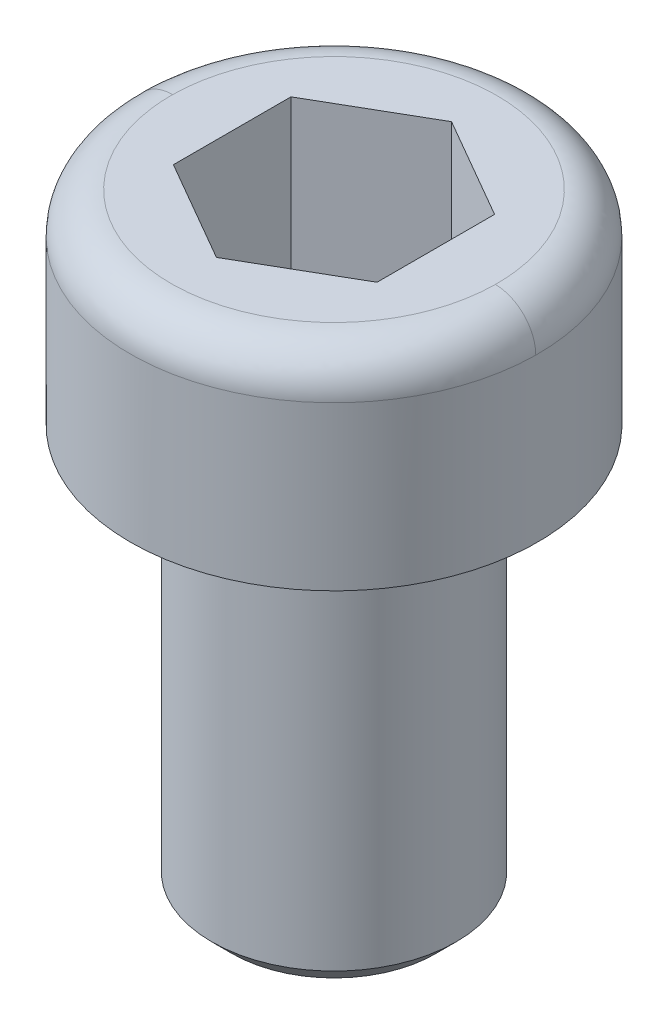
ISO-10303-21;
HEADER;
FILE_DESCRIPTION(('STEP AP214'),'2;1');
FILE_NAME('part.step','',(''),(''),'','','');
FILE_SCHEMA(('AUTOMOTIVE_DESIGN { 1 0 10303 214 1 1 1 1 }'));
ENDSEC;
DATA;
#1=APPLICATION_CONTEXT('core data for automotive mechanical design processes');
#2=APPLICATION_PROTOCOL_DEFINITION('international standard','automotive_design',2000,#1);
#3=PRODUCT_CONTEXT('',#1,'mechanical');
#4=PRODUCT('Part','Part','',(#3));
#5=PRODUCT_RELATED_PRODUCT_CATEGORY('part','',(#4));
#6=PRODUCT_DEFINITION_FORMATION('','',#4);
#7=PRODUCT_DEFINITION_CONTEXT('part definition',#1,'design');
#8=PRODUCT_DEFINITION('design','',#6,#7);
#9=PRODUCT_DEFINITION_SHAPE('','',#8);
#10=(LENGTH_UNIT() NAMED_UNIT(*) SI_UNIT(.MILLI.,.METRE.));
#11=(NAMED_UNIT(*) PLANE_ANGLE_UNIT() SI_UNIT($,.RADIAN.));
#12=(NAMED_UNIT(*) SI_UNIT($,.STERADIAN.) SOLID_ANGLE_UNIT());
#13=UNCERTAINTY_MEASURE_WITH_UNIT(LENGTH_MEASURE(1.E-05),#10,'distance_accuracy_value','');
#14=(GEOMETRIC_REPRESENTATION_CONTEXT(3) GLOBAL_UNCERTAINTY_ASSIGNED_CONTEXT((#13)) GLOBAL_UNIT_ASSIGNED_CONTEXT((#10,
#11,#12)) REPRESENTATION_CONTEXT('',''));
#15=CARTESIAN_POINT('',(0.,0.,0.));
#16=DIRECTION('',(0.,0.,1.));
#17=DIRECTION('',(1.,0.,0.));
#18=AXIS2_PLACEMENT_3D('',#15,#16,#17);
#19=CARTESIAN_POINT('',(-32.9999999892,15.499999988,88.9433756816));
#20=DIRECTION('',(0.500000003922235,0.,0.866025401519935));
#21=DIRECTION('',(0.866025401519935,0.,-0.500000003922235));
#22=AXIS2_PLACEMENT_3D('',#19,#20,#21);
#23=PLANE('',#22);
#24=DIRECTION('',(0.,1.,0.));
#25=VECTOR('',#24,1.);
#26=CARTESIAN_POINT('',(-32.9999999892,16.4999999946,88.9433756816));
#27=LINE('',#26,#25);
#28=CARTESIAN_POINT('',(-32.9999999927244,15.499999988,88.9433756813983));
#29=VERTEX_POINT('',#28);
#30=CARTESIAN_POINT('',(-32.999999989706,17.5000000012,88.9433756816256));
#31=VERTEX_POINT('',#30);
#32=EDGE_CURVE('E174',#29,#31,#27,.T.);
#33=ORIENTED_EDGE('',*,*,#32,.T.);
#34=DIRECTION('',(-0.866025401519935,0.,0.500000003922235));
#35=VECTOR('',#34,1.);
#36=CARTESIAN_POINT('',(-32.3749999946,17.5000000012,88.5825317627));
#37=LINE('',#36,#35);
#38=CARTESIAN_POINT('',(-31.7499999942707,17.5000000012,88.2216878441177));
#39=VERTEX_POINT('',#38);
#40=EDGE_CURVE('E171',#39,#31,#37,.T.);
#41=ORIENTED_EDGE('',*,*,#40,.F.);
#42=DIRECTION('',(0.,-1.,0.));
#43=VECTOR('',#42,1.);
#44=CARTESIAN_POINT('',(-31.75,16.4999999946,88.2216878438));
#45=LINE('',#44,#43);
#46=CARTESIAN_POINT('',(-31.75,15.499999988,88.2216878438));
#47=VERTEX_POINT('',#46);
#48=EDGE_CURVE('E91',#39,#47,#45,.T.);
#49=ORIENTED_EDGE('',*,*,#48,.T.);
#50=DIRECTION('',(0.866025401519935,0.,-0.500000003922235));
#51=VECTOR('',#50,1.);
#52=CARTESIAN_POINT('',(-32.3749999946,15.499999988,88.5825317627));
#53=LINE('',#52,#51);
#54=EDGE_CURVE('E87',#29,#47,#53,.T.);
#55=ORIENTED_EDGE('',*,*,#54,.F.);
#56=EDGE_LOOP('',(#33,#41,#49,#55));
#57=FACE_BOUND('',#56,.T.);
#58=ADVANCED_FACE('F16',(#57),#23,.F.);
#59=CARTESIAN_POINT('',(-31.7350004872,9.9999999898,88.7649995334));
#60=DIRECTION('',(0.,-1.,0.));
#61=DIRECTION('',(-1.,0.,0.));
#62=AXIS2_PLACEMENT_3D('',#59,#60,#61);
#63=PLANE('',#62);
#64=CARTESIAN_POINT('',(-32.9999999892,10.000000193,87.500000006));
#65=DIRECTION('',(0.,1.,0.));
#66=DIRECTION('',(0.,0.,1.));
#67=AXIS2_PLACEMENT_3D('',#64,#65,#66);
#68=CIRCLE('',#67,1.24999953199996);
#69=CARTESIAN_POINT('',(-32.9999999892,10.000000193,88.749999538));
#70=VERTEX_POINT('',#69);
#71=EDGE_CURVE('E21',#70,#70,#68,.F.);
#72=ORIENTED_EDGE('',*,*,#71,.T.);
#73=EDGE_LOOP('',(#72));
#74=FACE_BOUND('',#73,.T.);
#75=ADVANCED_FACE('F302',(#74),#63,.T.);
#76=CARTESIAN_POINT('',(-34.2500000038,15.499999988,88.2216878438));
#77=DIRECTION('',(-0.499999996302237,0.,0.866025405919343));
#78=DIRECTION('',(0.866025405919343,0.,0.499999996302237));
#79=AXIS2_PLACEMENT_3D('',#76,#77,#78);
#80=PLANE('',#79);
#81=DIRECTION('',(0.,1.,0.));
#82=VECTOR('',#81,1.);
#83=CARTESIAN_POINT('',(-34.2500000038,16.4999999946,88.2216878438));
#84=LINE('',#83,#82);
#85=CARTESIAN_POINT('',(-34.2500000038,15.499999988,88.2216878438));
#86=VERTEX_POINT('',#85);
#87=CARTESIAN_POINT('',(-34.2500000003147,17.5000000012,88.2216878439589));
#88=VERTEX_POINT('',#87);
#89=EDGE_CURVE('E142',#86,#88,#84,.T.);
#90=ORIENTED_EDGE('',*,*,#89,.T.);
#91=DIRECTION('',(-0.866025405919343,0.,-0.499999996302237));
#92=VECTOR('',#91,1.);
#93=CARTESIAN_POINT('',(-33.6249999965,17.5000000012,88.5825317627));
#94=LINE('',#93,#92);
#95=EDGE_CURVE('E177',#31,#88,#94,.T.);
#96=ORIENTED_EDGE('',*,*,#95,.F.);
#97=ORIENTED_EDGE('',*,*,#32,.F.);
#98=DIRECTION('',(0.866025405919343,0.,0.499999996302237));
#99=VECTOR('',#98,1.);
#100=CARTESIAN_POINT('',(-33.6249999965,15.499999988,88.5825317627));
#101=LINE('',#100,#99);
#102=EDGE_CURVE('E179',#86,#29,#101,.T.);
#103=ORIENTED_EDGE('',*,*,#102,.F.);
#104=EDGE_LOOP('',(#90,#96,#97,#103));
#105=FACE_BOUND('',#104,.T.);
#106=ADVANCED_FACE('F298',(#105),#80,.F.);
#107=CARTESIAN_POINT('',(-31.75,15.499999988,88.2216878438));
#108=DIRECTION('',(1.,0.,0.));
#109=DIRECTION('',(0.,0.,-1.));
#110=AXIS2_PLACEMENT_3D('',#107,#108,#109);
#111=PLANE('',#110);
#112=ORIENTED_EDGE('',*,*,#48,.F.);
#113=DIRECTION('',(0.,0.,1.));
#114=VECTOR('',#113,1.);
#115=CARTESIAN_POINT('',(-31.75,17.5000000012,87.500000006));
#116=LINE('',#115,#114);
#117=CARTESIAN_POINT('',(-31.7499999942707,17.5000000012,86.7783121678823));
#118=VERTEX_POINT('',#117);
#119=EDGE_CURVE('E97',#118,#39,#116,.T.);
#120=ORIENTED_EDGE('',*,*,#119,.F.);
#121=DIRECTION('',(0.,-1.,0.));
#122=VECTOR('',#121,1.);
#123=CARTESIAN_POINT('',(-31.75,16.4999999946,86.7783121682));
#124=LINE('',#123,#122);
#125=CARTESIAN_POINT('',(-31.75,15.499999988,86.7783121682));
#126=VERTEX_POINT('',#125);
#127=EDGE_CURVE('E94',#118,#126,#124,.T.);
#128=ORIENTED_EDGE('',*,*,#127,.T.);
#129=DIRECTION('',(0.,0.,-1.));
#130=VECTOR('',#129,1.);
#131=CARTESIAN_POINT('',(-31.75,15.499999988,87.500000006));
#132=LINE('',#131,#130);
#133=EDGE_CURVE('E79',#47,#126,#132,.T.);
#134=ORIENTED_EDGE('',*,*,#133,.F.);
#135=EDGE_LOOP('',(#112,#120,#128,#134));
#136=FACE_BOUND('',#135,.T.);
#137=ADVANCED_FACE('F95',(#136),#111,.F.);
#138=CARTESIAN_POINT('',(-32.9999999892,10.000000193,87.500000006));
#139=DIRECTION('',(0.,1.,0.));
#140=DIRECTION('',(0.,0.,1.));
#141=AXIS2_PLACEMENT_3D('',#138,#139,#140);
#142=CONICAL_SURFACE('',#141,1.249999532,0.785397960197718);
#143=CARTESIAN_POINT('',(-32.9999999892,10.2500005566,87.500000006));
#144=DIRECTION('',(0.,-1.,0.));
#145=DIRECTION('',(0.,0.,-1.));
#146=AXIS2_PLACEMENT_3D('',#143,#144,#145);
#147=CIRCLE('',#146,1.49999999720001);
#148=CARTESIAN_POINT('',(-32.9999999892,10.2500005566,86.0000000088));
#149=VERTEX_POINT('',#148);
#150=EDGE_CURVE('E108',#149,#149,#147,.T.);
#151=ORIENTED_EDGE('',*,*,#150,.T.);
#152=EDGE_LOOP('',(#151));
#153=FACE_BOUND('',#152,.T.);
#154=ORIENTED_EDGE('',*,*,#71,.F.);
#155=EDGE_LOOP('',(#154));
#156=FACE_BOUND('',#155,.T.);
#157=ADVANCED_FACE('F309',(#153,#156),#142,.T.);
#158=CARTESIAN_POINT('',(-34.2500000038,15.499999988,86.7783121682));
#159=DIRECTION('',(-1.,0.,0.));
#160=DIRECTION('',(0.,0.,1.));
#161=AXIS2_PLACEMENT_3D('',#158,#159,#160);
#162=PLANE('',#161);
#163=DIRECTION('',(0.,1.,0.));
#164=VECTOR('',#163,1.);
#165=CARTESIAN_POINT('',(-34.2500000038,16.4999999946,86.7783121682));
#166=LINE('',#165,#164);
#167=CARTESIAN_POINT('',(-34.2500000038,15.499999988,86.7783121682));
#168=VERTEX_POINT('',#167);
#169=CARTESIAN_POINT('',(-34.2500000038,17.5000000012,86.7783121682));
#170=VERTEX_POINT('',#169);
#171=EDGE_CURVE('E137',#168,#170,#166,.T.);
#172=ORIENTED_EDGE('',*,*,#171,.T.);
#173=DIRECTION('',(0.,0.,-1.));
#174=VECTOR('',#173,1.);
#175=CARTESIAN_POINT('',(-34.2500000038,17.5000000012,87.500000006));
#176=LINE('',#175,#174);
#177=EDGE_CURVE('E140',#88,#170,#176,.T.);
#178=ORIENTED_EDGE('',*,*,#177,.F.);
#179=ORIENTED_EDGE('',*,*,#89,.F.);
#180=DIRECTION('',(0.,0.,1.));
#181=VECTOR('',#180,1.);
#182=CARTESIAN_POINT('',(-34.2500000038,15.499999988,87.500000006));
#183=LINE('',#182,#181);
#184=EDGE_CURVE('E106',#168,#86,#183,.T.);
#185=ORIENTED_EDGE('',*,*,#184,.F.);
#186=EDGE_LOOP('',(#172,#178,#179,#185));
#187=FACE_BOUND('',#186,.T.);
#188=ADVANCED_FACE('F294',(#187),#162,.F.);
#189=CARTESIAN_POINT('',(-31.75,15.499999988,86.7783121682));
#190=DIRECTION('',(0.500000003922228,0.,-0.866025401519939));
#191=DIRECTION('',(-0.866025401519939,0.,-0.500000003922228));
#192=AXIS2_PLACEMENT_3D('',#189,#190,#191);
#193=PLANE('',#192);
#194=ORIENTED_EDGE('',*,*,#127,.F.);
#195=DIRECTION('',(0.866025401519939,0.,0.500000003922228));
#196=VECTOR('',#195,1.);
#197=CARTESIAN_POINT('',(-32.3749999946,17.5000000012,86.4174682493));
#198=LINE('',#197,#196);
#199=CARTESIAN_POINT('',(-32.9999999892,17.5000000012,86.0566243304));
#200=VERTEX_POINT('',#199);
#201=EDGE_CURVE('E100',#200,#118,#198,.T.);
#202=ORIENTED_EDGE('',*,*,#201,.F.);
#203=DIRECTION('',(0.,-1.,0.));
#204=VECTOR('',#203,1.);
#205=CARTESIAN_POINT('',(-32.9999999892,16.4999999946,86.0566243304));
#206=LINE('',#205,#204);
#207=CARTESIAN_POINT('',(-32.999999992375,15.499999988,86.0566243322331));
#208=VERTEX_POINT('',#207);
#209=EDGE_CURVE('E105',#200,#208,#206,.T.);
#210=ORIENTED_EDGE('',*,*,#209,.T.);
#211=DIRECTION('',(-0.866025403719635,0.,-0.500000000112244));
#212=VECTOR('',#211,1.);
#213=CARTESIAN_POINT('',(-31.75,15.499999988,86.7783121682));
#214=LINE('',#213,#212);
#215=EDGE_CURVE('E85',#126,#208,#214,.T.);
#216=ORIENTED_EDGE('',*,*,#215,.F.);
#217=EDGE_LOOP('',(#194,#202,#210,#216));
#218=FACE_BOUND('',#217,.T.);
#219=ADVANCED_FACE('F103',(#218),#193,.F.);
#220=CARTESIAN_POINT('',(-34.2500000038,15.499999988,88.9433756816));
#221=DIRECTION('',(0.,1.,0.));
#222=DIRECTION('',(1.,0.,0.));
#223=AXIS2_PLACEMENT_3D('',#220,#221,#222);
#224=PLANE('',#223);
#225=ORIENTED_EDGE('',*,*,#102,.T.);
#226=ORIENTED_EDGE('',*,*,#54,.T.);
#227=ORIENTED_EDGE('',*,*,#133,.T.);
#228=ORIENTED_EDGE('',*,*,#215,.T.);
#229=DIRECTION('',(-0.866025405919348,0.,0.499999996302229));
#230=VECTOR('',#229,1.);
#231=CARTESIAN_POINT('',(-33.6249999965,15.499999988,86.4174682493));
#232=LINE('',#231,#230);
#233=EDGE_CURVE('E115',#208,#168,#232,.T.);
#234=ORIENTED_EDGE('',*,*,#233,.T.);
#235=ORIENTED_EDGE('',*,*,#184,.T.);
#236=EDGE_LOOP('',(#225,#226,#227,#228,#234,#235));
#237=FACE_BOUND('',#236,.T.);
#238=ADVANCED_FACE('F82',(#237),#224,.T.);
#239=CARTESIAN_POINT('',(-32.9999999892,14.9999999974,87.500000006));
#240=DIRECTION('',(0.,-1.,0.));
#241=DIRECTION('',(0.,0.,-1.));
#242=AXIS2_PLACEMENT_3D('',#239,#240,#241);
#243=CYLINDRICAL_SURFACE('',#242,1.49999999720001);
#244=ORIENTED_EDGE('',*,*,#150,.F.);
#245=EDGE_LOOP('',(#244));
#246=FACE_BOUND('',#245,.T.);
#247=CARTESIAN_POINT('',(-32.9999999892,14.9999999974,87.500000006));
#248=DIRECTION('',(0.,-1.,0.));
#249=DIRECTION('',(0.,0.,-1.));
#250=AXIS2_PLACEMENT_3D('',#247,#248,#249);
#251=CIRCLE('',#250,1.49999999720001);
#252=CARTESIAN_POINT('',(-32.9999999892,14.9999999974,86.0000000088));
#253=VERTEX_POINT('',#252);
#254=EDGE_CURVE('E111',#253,#253,#251,.F.);
#255=ORIENTED_EDGE('',*,*,#254,.F.);
#256=EDGE_LOOP('',(#255));
#257=FACE_BOUND('',#256,.T.);
#258=ADVANCED_FACE('F243',(#246,#257),#243,.T.);
#259=CARTESIAN_POINT('',(-32.9999999892,15.499999988,86.0566243304));
#260=DIRECTION('',(-0.499999996302229,0.,-0.866025405919348));
#261=DIRECTION('',(-0.866025405919347,0.,0.499999996302229));
#262=AXIS2_PLACEMENT_3D('',#259,#260,#261);
#263=PLANE('',#262);
#264=ORIENTED_EDGE('',*,*,#209,.F.);
#265=DIRECTION('',(-0.866025405919347,0.,0.499999996302229));
#266=VECTOR('',#265,1.);
#267=CARTESIAN_POINT('',(-32.9999999892,17.5000000012,86.0566243304));
#268=LINE('',#267,#266);
#269=EDGE_CURVE('E128',#200,#170,#268,.T.);
#270=ORIENTED_EDGE('',*,*,#269,.T.);
#271=ORIENTED_EDGE('',*,*,#171,.F.);
#272=ORIENTED_EDGE('',*,*,#233,.F.);
#273=EDGE_LOOP('',(#264,#270,#271,#272));
#274=FACE_BOUND('',#273,.T.);
#275=ADVANCED_FACE('F291',(#274),#263,.F.);
#276=CARTESIAN_POINT('',(-30.4699999946,14.9999999974,90.0300000006));
#277=DIRECTION('',(0.,-1.,0.));
#278=DIRECTION('',(-1.,0.,0.));
#279=AXIS2_PLACEMENT_3D('',#276,#277,#278);
#280=PLANE('',#279);
#281=ORIENTED_EDGE('',*,*,#254,.T.);
#282=EDGE_LOOP('',(#281));
#283=FACE_BOUND('',#282,.T.);
#284=CARTESIAN_POINT('',(-32.9999999892,14.9999999974,87.500000006));
#285=DIRECTION('',(0.,-1.,0.));
#286=DIRECTION('',(0.,0.,-1.));
#287=AXIS2_PLACEMENT_3D('',#284,#285,#286);
#288=CIRCLE('',#287,2.50000000380003);
#289=CARTESIAN_POINT('',(-32.9999999892,14.9999999974,85.0000000022));
#290=VERTEX_POINT('',#289);
#291=EDGE_CURVE('E131',#290,#290,#288,.T.);
#292=ORIENTED_EDGE('',*,*,#291,.T.);
#293=EDGE_LOOP('',(#292));
#294=FACE_BOUND('',#293,.T.);
#295=ADVANCED_FACE('F242',(#283,#294),#280,.T.);
#296=CARTESIAN_POINT('',(-31.0071579356336,17.5000000012,87.5179514624186));
#297=CARTESIAN_POINT('',(-31.0176736581966,17.5000000012,88.6853313229468));
#298=CARTESIAN_POINT('',(-31.8505716104902,17.5000000012,89.5033578081431));
#299=CARTESIAN_POINT('',(-33.0179514710185,17.5000000012,89.4928420595664));
#300=CARTESIAN_POINT('',(-34.1853313315468,17.5000000012,89.4823263370035));
#301=CARTESIAN_POINT('',(-35.0033577907293,17.5000000012,88.6494283847097));
#302=CARTESIAN_POINT('',(-34.9928420681664,17.5000000012,87.4820485241815));
#303=CARTESIAN_POINT('',(-31.0047990085557,17.5000000012,87.5179727116124));
#304=CARTESIAN_POINT('',(-31.0153271785977,17.5000000012,88.6867343996312));
#305=CARTESIAN_POINT('',(-31.8492110321935,17.5000000012,89.5057291824954));
#306=CARTESIAN_POINT('',(-33.0179727202123,17.5000000012,89.4952009866443));
#307=CARTESIAN_POINT('',(-34.1867344082312,17.5000000012,89.4846728166023));
#308=CARTESIAN_POINT('',(-35.0057291652862,17.5000000012,88.6507889630065));
#309=CARTESIAN_POINT('',(-34.9952009952443,17.5000000012,87.4820272749876));
#310=CARTESIAN_POINT('',(-31.0024400814779,17.5000000012,87.5179939608062));
#311=CARTESIAN_POINT('',(-31.0129806989989,17.5000000012,88.6881374763156));
#312=CARTESIAN_POINT('',(-31.8478504538968,17.5000000012,89.5081005568477));
#313=CARTESIAN_POINT('',(-33.0179939694062,17.5000000012,89.4975599137221));
#314=CARTESIAN_POINT('',(-34.1881374849156,17.5000000012,89.4870192962012));
#315=CARTESIAN_POINT('',(-35.0081005398431,17.5000000012,88.6521495413032));
#316=CARTESIAN_POINT('',(-34.9975599223221,17.5000000012,87.4820060257938));
#317=CARTESIAN_POINT('',(-31.0000811544,17.5000000012,87.51801521));
#318=CARTESIAN_POINT('',(-31.0106342194,17.5000000012,88.689540553));
#319=CARTESIAN_POINT('',(-31.8464898756,17.5000000012,89.5104719312));
#320=CARTESIAN_POINT('',(-33.0180152186,17.5000000012,89.4999188408));
#321=CARTESIAN_POINT('',(-34.1895405616,17.5000000012,89.4893657758));
#322=CARTESIAN_POINT('',(-35.0104719144,17.5000000012,88.6535101196));
#323=CARTESIAN_POINT('',(-34.9999188494,17.5000000012,87.4819847766));
#324=CARTESIAN_POINT('',(-30.7071997996,17.5000000012,87.5206534826));
#325=CARTESIAN_POINT('',(-30.7192983276,17.5000000012,88.8637447512));
#326=CARTESIAN_POINT('',(-31.6775622226,17.5000000012,89.8048987236));
#327=CARTESIAN_POINT('',(-33.0206534912,17.5000000012,89.7928001956));
#328=CARTESIAN_POINT('',(-34.3637447598,17.5000000012,89.7807016676));
#329=CARTESIAN_POINT('',(-35.3048987322,17.5000000012,88.8224377726));
#330=CARTESIAN_POINT('',(-35.2928002042,17.5000000012,87.479346504));
#331=CARTESIAN_POINT('',(-30.500101433,17.2928932272,87.5225190364));
#332=CARTESIAN_POINT('',(-30.5132927706,17.2928932272,88.9869257088));
#333=CARTESIAN_POINT('',(-31.5581123472,17.2928932272,90.0130899252));
#334=CARTESIAN_POINT('',(-33.0225190196,17.2928932272,89.9998985876));
#335=CARTESIAN_POINT('',(-34.4869257174,17.2928932272,89.9867072246));
#336=CARTESIAN_POINT('',(-35.5130899084,17.2928932272,88.941887648));
#337=CARTESIAN_POINT('',(-35.4998985708,17.2928932272,87.4774809756));
#338=CARTESIAN_POINT('',(-30.500101433,17.0000000106,87.5225190364));
#339=CARTESIAN_POINT('',(-30.5132927706,17.0000000106,88.9869257088));
#340=CARTESIAN_POINT('',(-31.5581123472,17.0000000106,90.0130899252));
#341=CARTESIAN_POINT('',(-33.0225190196,17.0000000106,89.9998985876));
#342=CARTESIAN_POINT('',(-34.4869257174,17.0000000106,89.9867072246));
#343=CARTESIAN_POINT('',(-35.5130899084,17.0000000106,88.941887648));
#344=CARTESIAN_POINT('',(-35.4998985708,17.0000000106,87.4774809756));
#345=CARTESIAN_POINT('',(-30.500101433,16.9998000106,87.5225190364));
#346=CARTESIAN_POINT('',(-30.5132927706,16.9998000106,88.9869257088));
#347=CARTESIAN_POINT('',(-31.5581123472,16.9998000106,90.0130899252));
#348=CARTESIAN_POINT('',(-33.0225190196,16.9998000106,89.9998985876));
#349=CARTESIAN_POINT('',(-34.4869257174,16.9998000106,89.9867072246));
#350=CARTESIAN_POINT('',(-35.5130899084,16.9998000106,88.941887648));
#351=CARTESIAN_POINT('',(-35.4998985708,16.9998000106,87.4774809756));
#352=CARTESIAN_POINT('',(-30.500101433,16.9996000106,87.5225190364));
#353=CARTESIAN_POINT('',(-30.5132927706,16.9996000106,88.9869257088));
#354=CARTESIAN_POINT('',(-31.5581123472,16.9996000106,90.0130899252));
#355=CARTESIAN_POINT('',(-33.0225190196,16.9996000106,89.9998985876));
#356=CARTESIAN_POINT('',(-34.4869257174,16.9996000106,89.9867072246));
#357=CARTESIAN_POINT('',(-35.5130899084,16.9996000106,88.941887648));
#358=CARTESIAN_POINT('',(-35.4998985708,16.9996000106,87.4774809756));
#359=CARTESIAN_POINT('',(-30.500101433,16.9994000106,87.5225190364));
#360=CARTESIAN_POINT('',(-30.5132927706,16.9994000106,88.9869257088));
#361=CARTESIAN_POINT('',(-31.5581123472,16.9994000106,90.0130899252));
#362=CARTESIAN_POINT('',(-33.0225190196,16.9994000106,89.9998985876));
#363=CARTESIAN_POINT('',(-34.4869257174,16.9994000106,89.9867072246));
#364=CARTESIAN_POINT('',(-35.5130899084,16.9994000106,88.941887648));
#365=CARTESIAN_POINT('',(-35.4998985708,16.9994000106,87.4774809756));
#366=(BOUNDED_SURFACE() B_SPLINE_SURFACE(3,3,((#296,#297,#298,#299,#300,#301,#302),(#303,#304,
#305,#306,#307,#308,#309),(#310,#311,#312,#313,#314,#315,#316),(#317,#318,#319,#320,#321,#322,
#323),(#324,#325,#326,#327,#328,#329,#330),(#331,#332,#333,#334,#335,#336,#337),(#338,#339,#340,
#341,#342,#343,#344),(#345,#346,#347,#348,#349,#350,#351),(#352,#353,#354,#355,#356,#357,#358),
(#359,#360,#361,#362,#363,#364,#365)),.UNSPECIFIED.,.F.,.F.,.F.) B_SPLINE_SURFACE_WITH_KNOTS((4,
3,3,4),(4,3,4),(0.0118245362824919,0.0214045679639251,0.978595532615438,0.979407736107246),(0.,
0.5,1.),
.UNSPECIFIED.) GEOMETRIC_REPRESENTATION_ITEM() RATIONAL_B_SPLINE_SURFACE(((0.986784784485374,
0.794103069890036,0.794103069890036,0.986784784485374,0.794103069890036,0.794103069890036,
0.986784784485374),(0.986784784485374,0.794103069890036,0.794103069890036,0.986784784485374,
0.794103069890036,0.794103069890036,0.986784784485374),(0.986784784485374,0.794103069890036,
0.794103069890036,0.986784784485374,0.794103069890036,0.794103069890036,0.986784784485374),
(0.986784784485374,0.794103069890036,0.794103069890036,0.986784784485374,0.794103069890036,
0.794103069890036,0.986784784485374),(0.7941030797363,0.639044808292821,0.639044808292821,
0.7941030797363,0.639044808292821,0.639044808292821,0.7941030797363),(0.79410309998284,
0.639044824585978,0.639044824585978,0.79410309998284,0.639044824585978,0.639044824585978,
0.79410309998284),(0.986784845224994,0.794103118769508,0.794103118769508,0.986784845224994,
0.794103118769508,0.794103118769508,0.986784845224994),(0.986784845224994,0.794103118769508,
0.794103118769508,0.986784845224994,0.794103118769508,0.794103118769508,0.986784845224994),
(0.986784845224994,0.794103118769508,0.794103118769508,0.986784845224994,0.794103118769508,
0.794103118769508,0.986784845224994),(0.986784845224994,0.794103118769508,0.794103118769508,
0.986784845224994,0.794103118769508,0.794103118769508,0.986784845224994))) REPRESENTATION_ITEM('') SURFACE());
#367=CARTESIAN_POINT('',(-31.0000811543734,17.5000000012,87.5180152100002));
#368=CARTESIAN_POINT('',(-31.0106342193735,17.5000000012,88.6895405530159));
#369=CARTESIAN_POINT('',(-31.8464898755846,17.5000000012,89.5104719312268));
#370=CARTESIAN_POINT('',(-33.0180152186002,17.5000000012,89.4999188408266));
#371=CARTESIAN_POINT('',(-34.1895405616159,17.5000000012,89.4893657758265));
#372=CARTESIAN_POINT('',(-35.0104719144268,17.5000000012,88.6535101196154));
#373=CARTESIAN_POINT('',(-34.9999188494266,17.5000000012,87.4819847765997));
#374=(BOUNDED_CURVE() B_SPLINE_CURVE(3,(#367,#368,#369,#370,#371,#372,#373),.UNSPECIFIED.,.F.,
.F.) B_SPLINE_CURVE_WITH_KNOTS((4,3,4),(0.,0.5,1.),
.UNSPECIFIED.) CURVE() GEOMETRIC_REPRESENTATION_ITEM() RATIONAL_B_SPLINE_CURVE((0.986784784463599,
0.794103069872512,0.794103069872512,0.986784784463599,0.794103069872512,0.794103069872512,0.986784784463599)) REPRESENTATION_ITEM(''));
#375=CARTESIAN_POINT('',(-31.0000801273476,17.5000000012,87.5180152246213));
#376=VERTEX_POINT('',#375);
#377=CARTESIAN_POINT('',(-34.9999999834589,17.5000000012,87.500000003103));
#378=VERTEX_POINT('',#377);
#379=EDGE_CURVE('E127',#376,#378,#374,.T.);
#380=DIRECTION('',(-0.00450384429456971,0.,0.999989857641851));
#381=VECTOR('',#380,1.);
#382=CARTESIAN_POINT('',(-34.9999188494,17.5000000012,87.4819847766));
#383=LINE('',#382,#381);
#384=CARTESIAN_POINT('',(-34.9999198679857,17.5000000012,87.4819847704454));
#385=VERTEX_POINT('',#384);
#386=EDGE_CURVE('E118',#378,#385,#383,.F.);
#387=CARTESIAN_POINT('',(-35.4998985708,16.9929289430094,87.4774809756));
#388=CARTESIAN_POINT('',(-35.4998985708,16.9952859655396,87.4774809756));
#389=CARTESIAN_POINT('',(-35.4998985708,16.9976429880698,87.4774809756));
#390=CARTESIAN_POINT('',(-35.4998985708,17.0000000106,87.4774809756));
#391=CARTESIAN_POINT('',(-35.4998985708,17.2928932272,87.4774809756));
#392=CARTESIAN_POINT('',(-35.2928002042,17.5000000012,87.479346504));
#393=CARTESIAN_POINT('',(-34.9999188494,17.5000000012,87.4819847766));
#394=CARTESIAN_POINT('',(-34.9975383529696,17.5000000012,87.4820062200904));
#395=CARTESIAN_POINT('',(-34.9951578565392,17.5000000012,87.4820276635807));
#396=CARTESIAN_POINT('',(-34.9927773601089,17.5000000012,87.4820491070711));
#397=(BOUNDED_CURVE() B_SPLINE_CURVE(3,(#387,#388,#389,#390,#391,#392,#393,#394,#395,#396),
.UNSPECIFIED.,.F.,.F.) B_SPLINE_CURVE_WITH_KNOTS((4,3,3,4),(0.0117369392209449,0.02130884886746,
0.978499813518973,0.988167442261953),
.UNSPECIFIED.) CURVE() GEOMETRIC_REPRESENTATION_ITEM() RATIONAL_B_SPLINE_CURVE((0.986784845224994,
0.986784845224994,0.986784845224994,0.986784845224994,0.79410309998284,0.7941030797363,
0.986784784485374,0.986784784485374,0.986784784485374,0.986784784485374)) REPRESENTATION_ITEM(''));
#398=CARTESIAN_POINT('',(-35.4998985703308,17.0000000104296,87.4774809769439));
#399=VERTEX_POINT('',#398);
#400=EDGE_CURVE('E114',#399,#385,#397,.T.);
#401=CARTESIAN_POINT('',(-32.9999999892,17.0000000106,87.500000006));
#402=DIRECTION('',(0.,-1.,0.));
#403=DIRECTION('',(0.,0.,-1.));
#404=AXIS2_PLACEMENT_3D('',#401,#402,#403);
#405=CIRCLE('',#404,2.50000000380003);
#406=CARTESIAN_POINT('',(-30.5001014233055,17.0000000104296,87.5225190346459));
#407=VERTEX_POINT('',#406);
#408=EDGE_CURVE('E134',#399,#407,#405,.F.);
#409=CARTESIAN_POINT('',(-31.0072226436912,17.5000000012,87.517950879529));
#410=CARTESIAN_POINT('',(-31.0048421472608,17.5000000012,87.5179723230193));
#411=CARTESIAN_POINT('',(-31.0024616508304,17.5000000012,87.5179937665097));
#412=CARTESIAN_POINT('',(-31.0000811544,17.5000000012,87.51801521));
#413=CARTESIAN_POINT('',(-30.7071997996,17.5000000012,87.5206534826));
#414=CARTESIAN_POINT('',(-30.500101433,17.2928932272,87.5225190364));
#415=CARTESIAN_POINT('',(-30.500101433,17.0000000106,87.5225190364));
#416=CARTESIAN_POINT('',(-30.500101433,16.9976429880698,87.5225190364));
#417=CARTESIAN_POINT('',(-30.500101433,16.9952859655396,87.5225190364));
#418=CARTESIAN_POINT('',(-30.500101433,16.9929289430094,87.5225190364));
#419=(BOUNDED_CURVE() B_SPLINE_CURVE(3,(#409,#410,#411,#412,#413,#414,#415,#416,#417,#418),
.UNSPECIFIED.,.F.,.F.) B_SPLINE_CURVE_WITH_KNOTS((4,3,3,4),(0.0117369392209448,
0.0214045679639251,0.978595532615438,0.988167442261953),
.UNSPECIFIED.) CURVE() GEOMETRIC_REPRESENTATION_ITEM() RATIONAL_B_SPLINE_CURVE((0.986784784485374,
0.986784784485374,0.986784784485374,0.986784784485374,0.7941030797363,0.79410309998284,
0.986784845224994,0.986784845224994,0.986784845224994,0.986784845224994)) REPRESENTATION_ITEM(''));
#420=EDGE_CURVE('E122',#376,#407,#419,.T.);
#421=ORIENTED_EDGE('',*,*,#379,.T.);
#422=ORIENTED_EDGE('',*,*,#386,.T.);
#423=ORIENTED_EDGE('',*,*,#400,.F.);
#424=ORIENTED_EDGE('',*,*,#408,.T.);
#425=ORIENTED_EDGE('',*,*,#420,.F.);
#426=EDGE_LOOP('',(#421,#422,#423,#424,#425));
#427=FACE_BOUND('',#426,.T.);
#428=ADVANCED_FACE('F231',(#427),#366,.F.);
#429=CARTESIAN_POINT('',(-30.9759999986,17.5000000012,89.5241105628));
#430=DIRECTION('',(0.,-1.,0.));
#431=DIRECTION('',(-1.,0.,0.));
#432=AXIS2_PLACEMENT_3D('',#429,#430,#431);
#433=PLANE('',#432);
#434=ORIENTED_EDGE('',*,*,#201,.T.);
#435=ORIENTED_EDGE('',*,*,#119,.T.);
#436=ORIENTED_EDGE('',*,*,#40,.T.);
#437=ORIENTED_EDGE('',*,*,#95,.T.);
#438=ORIENTED_EDGE('',*,*,#177,.T.);
#439=ORIENTED_EDGE('',*,*,#269,.F.);
#440=EDGE_LOOP('',(#434,#435,#436,#437,#438,#439));
#441=FACE_BOUND('',#440,.T.);
#442=DIRECTION('',(0.00450386583628738,0.,-0.99998985754483));
#443=VECTOR('',#442,1.);
#444=CARTESIAN_POINT('',(-31.0000811544,17.5000000012,87.51801521));
#445=LINE('',#444,#443);
#446=CARTESIAN_POINT('',(-31.0000000074479,17.5000000012,87.4999999963902));
#447=VERTEX_POINT('',#446);
#448=EDGE_CURVE('E121',#447,#376,#445,.F.);
#449=ORIENTED_EDGE('',*,*,#448,.F.);
#450=CARTESIAN_POINT('',(-34.9999188494266,17.5000000012,87.4819847765998));
#451=CARTESIAN_POINT('',(-34.9893657844265,17.5000000012,86.3104594335842));
#452=CARTESIAN_POINT('',(-34.1535101282154,17.5000000012,85.4895280807732));
#453=CARTESIAN_POINT('',(-32.9819847851998,17.5000000012,85.5000811457734));
#454=CARTESIAN_POINT('',(-31.8104594421842,17.5000000012,85.5106342107735));
#455=CARTESIAN_POINT('',(-30.9895280639732,17.5000000012,86.3464898923846));
#456=CARTESIAN_POINT('',(-31.0000811543734,17.5000000012,87.5180152100003));
#457=(BOUNDED_CURVE() B_SPLINE_CURVE(3,(#450,#451,#452,#453,#454,#455,#456),.UNSPECIFIED.,.F.,
.F.) B_SPLINE_CURVE_WITH_KNOTS((4,3,4),(0.,0.5,1.),
.UNSPECIFIED.) CURVE() GEOMETRIC_REPRESENTATION_ITEM() RATIONAL_B_SPLINE_CURVE((0.986784784463599,
0.794103069872512,0.794103069872512,0.986784784463599,0.794103069872512,0.794103069872512,0.986784784463599)) REPRESENTATION_ITEM(''));
#458=EDGE_CURVE('E27',#447,#385,#457,.F.);
#459=ORIENTED_EDGE('',*,*,#458,.T.);
#460=ORIENTED_EDGE('',*,*,#386,.F.);
#461=ORIENTED_EDGE('',*,*,#379,.F.);
#462=EDGE_LOOP('',(#449,#459,#460,#461));
#463=FACE_BOUND('',#462,.T.);
#464=ADVANCED_FACE('F18',(#441,#463),#433,.F.);
#465=CARTESIAN_POINT('',(-32.9999999892,17.0000000106,87.500000006));
#466=DIRECTION('',(0.,-1.,0.));
#467=DIRECTION('',(0.,0.,-1.));
#468=AXIS2_PLACEMENT_3D('',#465,#466,#467);
#469=CYLINDRICAL_SURFACE('',#468,2.50000000380003);
#470=ORIENTED_EDGE('',*,*,#291,.F.);
#471=EDGE_LOOP('',(#470));
#472=FACE_BOUND('',#471,.T.);
#473=ORIENTED_EDGE('',*,*,#408,.F.);
#474=CARTESIAN_POINT('',(-32.9999999892,17.0000000106,87.500000006));
#475=DIRECTION('',(0.,-1.,0.));
#476=DIRECTION('',(0.,0.,-1.));
#477=AXIS2_PLACEMENT_3D('',#474,#475,#476);
#478=CIRCLE('',#477,2.50000000380003);
#479=EDGE_CURVE('E11',#399,#407,#478,.T.);
#480=ORIENTED_EDGE('',*,*,#479,.T.);
#481=EDGE_LOOP('',(#473,#480));
#482=FACE_BOUND('',#481,.T.);
#483=ADVANCED_FACE('F203',(#472,#482),#469,.T.);
#484=CARTESIAN_POINT('',(-34.9927773601089,17.5000000012,87.4820491070711));
#485=CARTESIAN_POINT('',(-34.9822619796138,17.5000000012,86.314707151026));
#486=CARTESIAN_POINT('',(-34.1493910710968,17.5000000012,85.4967072539768));
#487=CARTESIAN_POINT('',(-32.9820491156711,17.5000000012,85.5072226344718));
#488=CARTESIAN_POINT('',(-31.8147071602453,17.5000000012,85.5177380155862));
#489=CARTESIAN_POINT('',(-30.9967072365574,17.5000000012,86.3506089495032));
#490=CARTESIAN_POINT('',(-31.0072226436912,17.5000000012,87.517950879529));
#491=CARTESIAN_POINT('',(-34.9951578565392,17.5000000012,87.4820276635807));
#492=CARTESIAN_POINT('',(-34.9846299145425,17.5000000012,86.3132912452173));
#493=CARTESIAN_POINT('',(-34.1507640901312,17.5000000012,85.4943141962512));
#494=CARTESIAN_POINT('',(-32.9820276721807,17.5000000012,85.5048421382479));
#495=CARTESIAN_POINT('',(-31.8132912542302,17.5000000012,85.5153700806575));
#496=CARTESIAN_POINT('',(-30.9943141790383,17.5000000012,86.3492359304688));
#497=CARTESIAN_POINT('',(-31.0048421472608,17.5000000012,87.5179723230193));
#498=CARTESIAN_POINT('',(-34.9975383529696,17.5000000012,87.4820062200904));
#499=CARTESIAN_POINT('',(-34.9869978494713,17.5000000012,86.3118753394087));
#500=CARTESIAN_POINT('',(-34.1521371091656,17.5000000012,85.4919211385256));
#501=CARTESIAN_POINT('',(-32.9820062286904,17.5000000012,85.5024616420239));
#502=CARTESIAN_POINT('',(-31.8118753482151,17.5000000012,85.5130021457287));
#503=CARTESIAN_POINT('',(-30.9919211215191,17.5000000012,86.3478629114344));
#504=CARTESIAN_POINT('',(-31.0024616508304,17.5000000012,87.5179937665097));
#505=CARTESIAN_POINT('',(-34.9999188494,17.5000000012,87.4819847766));
#506=CARTESIAN_POINT('',(-34.9893657844,17.5000000012,86.3104594336));
#507=CARTESIAN_POINT('',(-34.1535101282,17.5000000012,85.4895280808));
#508=CARTESIAN_POINT('',(-32.9819847852,17.5000000012,85.5000811458));
#509=CARTESIAN_POINT('',(-31.8104594422,17.5000000012,85.5106342108));
#510=CARTESIAN_POINT('',(-30.989528064,17.5000000012,86.3464898924));
#511=CARTESIAN_POINT('',(-31.0000811544,17.5000000012,87.51801521));
#512=CARTESIAN_POINT('',(-35.2928002042,17.5000000012,87.479346504));
#513=CARTESIAN_POINT('',(-35.2807016508,17.5000000012,86.1362552608));
#514=CARTESIAN_POINT('',(-34.3224377812,17.5000000012,85.195101263));
#515=CARTESIAN_POINT('',(-32.9793465126,17.5000000012,85.2071998164));
#516=CARTESIAN_POINT('',(-31.636255244,17.5000000012,85.2192983444));
#517=CARTESIAN_POINT('',(-30.6951012716,17.5000000012,86.1775622394));
#518=CARTESIAN_POINT('',(-30.7071997996,17.5000000012,87.5206534826));
#519=CARTESIAN_POINT('',(-35.4998985708,17.2928932272,87.4774809756));
#520=CARTESIAN_POINT('',(-35.4867072332,17.2928932272,86.0130743032));
#521=CARTESIAN_POINT('',(-34.4418876566,17.2928932272,84.9869100868));
#522=CARTESIAN_POINT('',(-32.9774809842,17.2928932272,85.0001014244));
#523=CARTESIAN_POINT('',(-31.5130742864,17.2928932272,85.013292762));
#524=CARTESIAN_POINT('',(-30.4869100954,17.2928932272,86.0581123386));
#525=CARTESIAN_POINT('',(-30.500101433,17.2928932272,87.5225190364));
#526=CARTESIAN_POINT('',(-35.4998985708,17.0000000106,87.4774809756));
#527=CARTESIAN_POINT('',(-35.4867072332,17.0000000106,86.0130743032));
#528=CARTESIAN_POINT('',(-34.4418876566,17.0000000106,84.9869100868));
#529=CARTESIAN_POINT('',(-32.9774809842,17.0000000106,85.0001014244));
#530=CARTESIAN_POINT('',(-31.5130742864,17.0000000106,85.013292762));
#531=CARTESIAN_POINT('',(-30.4869100954,17.0000000106,86.0581123386));
#532=CARTESIAN_POINT('',(-30.500101433,17.0000000106,87.5225190364));
#533=CARTESIAN_POINT('',(-35.4998985708,16.9976429880698,87.4774809756));
#534=CARTESIAN_POINT('',(-35.4867072332,16.9976429880698,86.0130743032));
#535=CARTESIAN_POINT('',(-34.4418876566,16.9976429880698,84.9869100868));
#536=CARTESIAN_POINT('',(-32.9774809842,16.9976429880698,85.0001014244));
#537=CARTESIAN_POINT('',(-31.5130742864,16.9976429880698,85.013292762));
#538=CARTESIAN_POINT('',(-30.4869100954,16.9976429880698,86.0581123386));
#539=CARTESIAN_POINT('',(-30.500101433,16.9976429880698,87.5225190364));
#540=CARTESIAN_POINT('',(-35.4998985708,16.9952859655396,87.4774809756));
#541=CARTESIAN_POINT('',(-35.4867072332,16.9952859655396,86.0130743032));
#542=CARTESIAN_POINT('',(-34.4418876566,16.9952859655396,84.9869100868));
#543=CARTESIAN_POINT('',(-32.9774809842,16.9952859655396,85.0001014244));
#544=CARTESIAN_POINT('',(-31.5130742864,16.9952859655396,85.013292762));
#545=CARTESIAN_POINT('',(-30.4869100954,16.9952859655396,86.0581123386));
#546=CARTESIAN_POINT('',(-30.500101433,16.9952859655396,87.5225190364));
#547=CARTESIAN_POINT('',(-35.4998985708,16.9929289430094,87.4774809756));
#548=CARTESIAN_POINT('',(-35.4867072332,16.9929289430094,86.0130743032));
#549=CARTESIAN_POINT('',(-34.4418876566,16.9929289430094,84.9869100868));
#550=CARTESIAN_POINT('',(-32.9774809842,16.9929289430094,85.0001014244));
#551=CARTESIAN_POINT('',(-31.5130742864,16.9929289430094,85.013292762));
#552=CARTESIAN_POINT('',(-30.4869100954,16.9929289430094,86.0581123386));
#553=CARTESIAN_POINT('',(-30.500101433,16.9929289430094,87.5225190364));
#554=(BOUNDED_SURFACE() B_SPLINE_SURFACE(3,3,((#484,#485,#486,#487,#488,#489,#490),(#491,#492,
#493,#494,#495,#496,#497),(#498,#499,#500,#501,#502,#503,#504),(#505,#506,#507,#508,#509,#510,
#511),(#512,#513,#514,#515,#516,#517,#518),(#519,#520,#521,#522,#523,#524,#525),(#526,#527,#528,
#529,#530,#531,#532),(#533,#534,#535,#536,#537,#538,#539),(#540,#541,#542,#543,#544,#545,#546),
(#547,#548,#549,#550,#551,#552,#553)),.UNSPECIFIED.,.F.,.F.,.F.) B_SPLINE_SURFACE_WITH_KNOTS((4,
3,3,4),(4,3,4),(0.0117369392209448,0.0214045679639251,0.978595532615438,0.988167442261953),(0.,
0.5,1.),
.UNSPECIFIED.) GEOMETRIC_REPRESENTATION_ITEM() RATIONAL_B_SPLINE_SURFACE(((0.986784784485374,
0.794103069890035,0.794103069890035,0.986784784485374,0.794103069890035,0.794103069890035,
0.986784784485374),(0.986784784485374,0.794103069890035,0.794103069890035,0.986784784485374,
0.794103069890035,0.794103069890035,0.986784784485374),(0.986784784485374,0.794103069890035,
0.794103069890035,0.986784784485374,0.794103069890035,0.794103069890035,0.986784784485374),
(0.986784784485374,0.794103069890035,0.794103069890035,0.986784784485374,0.794103069890035,
0.794103069890035,0.986784784485374),(0.7941030797363,0.63904480829282,0.63904480829282,
0.7941030797363,0.63904480829282,0.63904480829282,0.7941030797363),(0.79410309998284,
0.639044824585977,0.639044824585977,0.79410309998284,0.639044824585977,0.639044824585977,
0.79410309998284),(0.986784845224994,0.794103118769506,0.794103118769506,0.986784845224994,
0.794103118769506,0.794103118769506,0.986784845224994),(0.986784845224994,0.794103118769506,
0.794103118769506,0.986784845224994,0.794103118769506,0.794103118769506,0.986784845224994),
(0.986784845224994,0.794103118769506,0.794103118769506,0.986784845224994,0.794103118769506,
0.794103118769506,0.986784845224994),(0.986784845224994,0.794103118769506,0.794103118769506,
0.986784845224994,0.794103118769506,0.794103118769506,0.986784845224994))) REPRESENTATION_ITEM('') SURFACE());
#555=ORIENTED_EDGE('',*,*,#420,.T.);
#556=ORIENTED_EDGE('',*,*,#479,.F.);
#557=ORIENTED_EDGE('',*,*,#400,.T.);
#558=ORIENTED_EDGE('',*,*,#458,.F.);
#559=ORIENTED_EDGE('',*,*,#448,.T.);
#560=EDGE_LOOP('',(#555,#556,#557,#558,#559));
#561=FACE_BOUND('',#560,.T.);
#562=ADVANCED_FACE('F192',(#561),#554,.F.);
#563=CLOSED_SHELL('',(#58,#75,#106,#137,#157,#188,#219,#238,#258,#275,#295,#428,#464,#483,#562));
#564=MANIFOLD_SOLID_BREP('B1',#563);
#565=ADVANCED_BREP_SHAPE_REPRESENTATION('',(#18,#564),#14);
#566=SHAPE_DEFINITION_REPRESENTATION(#9,#565);
ENDSEC;
END-ISO-10303-21;
